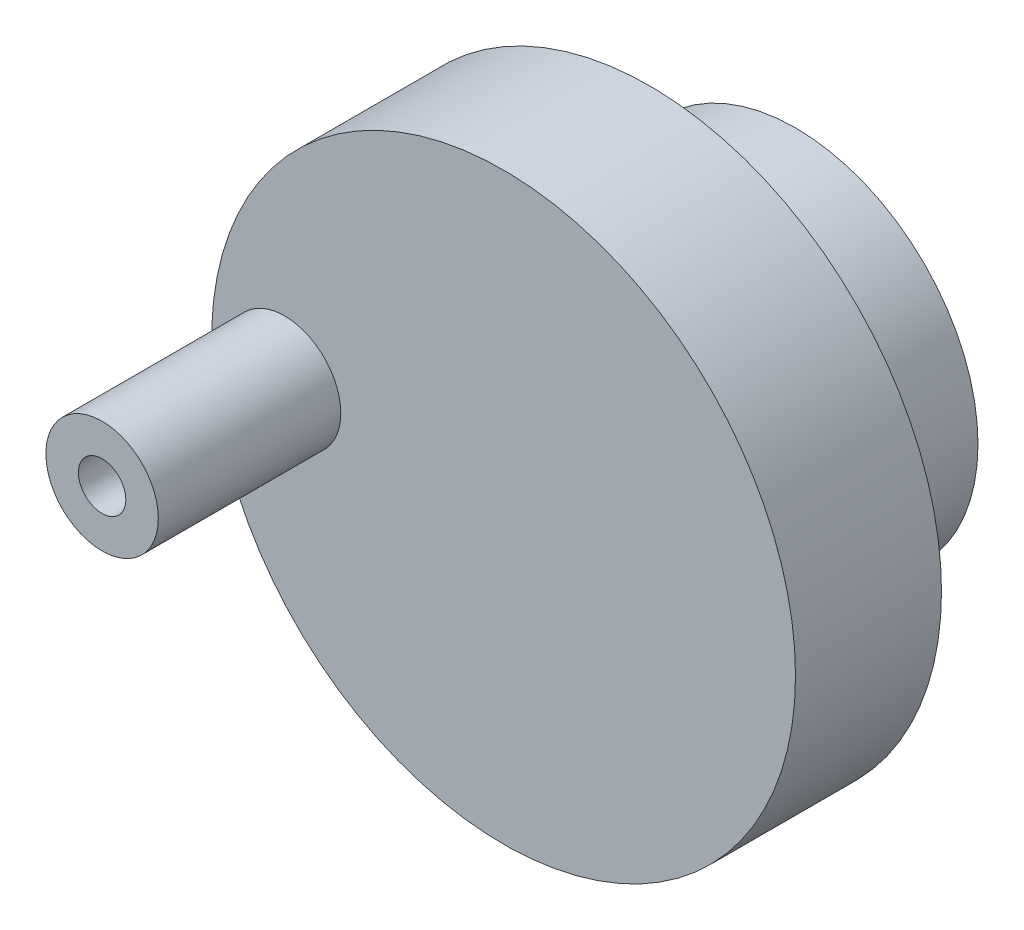
ISO-10303-21;
HEADER;
FILE_DESCRIPTION(('STEP AP214'),'2;1');
FILE_NAME('part.step','',(''),(''),'','','');
FILE_SCHEMA(('AUTOMOTIVE_DESIGN { 1 0 10303 214 1 1 1 1 }'));
ENDSEC;
DATA;
#1=APPLICATION_CONTEXT('core data for automotive mechanical design processes');
#2=APPLICATION_PROTOCOL_DEFINITION('international standard','automotive_design',2000,#1);
#3=PRODUCT_CONTEXT('',#1,'mechanical');
#4=PRODUCT('Part','Part','',(#3));
#5=PRODUCT_RELATED_PRODUCT_CATEGORY('part','',(#4));
#6=PRODUCT_DEFINITION_FORMATION('','',#4);
#7=PRODUCT_DEFINITION_CONTEXT('part definition',#1,'design');
#8=PRODUCT_DEFINITION('design','',#6,#7);
#9=PRODUCT_DEFINITION_SHAPE('','',#8);
#10=(LENGTH_UNIT() NAMED_UNIT(*) SI_UNIT(.MILLI.,.METRE.));
#11=(NAMED_UNIT(*) PLANE_ANGLE_UNIT() SI_UNIT($,.RADIAN.));
#12=(NAMED_UNIT(*) SI_UNIT($,.STERADIAN.) SOLID_ANGLE_UNIT());
#13=UNCERTAINTY_MEASURE_WITH_UNIT(LENGTH_MEASURE(1.E-05),#10,'distance_accuracy_value','');
#14=(GEOMETRIC_REPRESENTATION_CONTEXT(3) GLOBAL_UNCERTAINTY_ASSIGNED_CONTEXT((#13)) GLOBAL_UNIT_ASSIGNED_CONTEXT((#10,
#11,#12)) REPRESENTATION_CONTEXT('',''));
#15=CARTESIAN_POINT('',(0.,0.,0.));
#16=DIRECTION('',(0.,0.,1.));
#17=DIRECTION('',(1.,0.,0.));
#18=AXIS2_PLACEMENT_3D('',#15,#16,#17);
#19=CARTESIAN_POINT('',(0.,0.,0.));
#20=DIRECTION('',(0.,0.,1.));
#21=DIRECTION('',(1.,0.,0.));
#22=AXIS2_PLACEMENT_3D('',#19,#20,#21);
#23=PLANE('',#22);
#24=CARTESIAN_POINT('',(0.,0.,0.));
#25=DIRECTION('',(0.,0.,1.));
#26=DIRECTION('',(1.,0.,0.));
#27=AXIS2_PLACEMENT_3D('',#24,#25,#26);
#28=CIRCLE('',#27,17.5);
#29=CARTESIAN_POINT('',(17.5,0.,0.));
#30=VERTEX_POINT('',#29);
#31=EDGE_CURVE('E11',#30,#30,#28,.T.);
#32=ORIENTED_EDGE('',*,*,#31,.T.);
#33=EDGE_LOOP('',(#32));
#34=FACE_BOUND('',#33,.T.);
#35=CARTESIAN_POINT('',(0.,0.,0.));
#36=DIRECTION('',(0.,0.,1.));
#37=DIRECTION('',(1.,0.,0.));
#38=AXIS2_PLACEMENT_3D('',#35,#36,#37);
#39=CIRCLE('',#38,20.);
#40=CARTESIAN_POINT('',(20.,0.,0.));
#41=VERTEX_POINT('',#40);
#42=EDGE_CURVE('E155',#41,#41,#39,.T.);
#43=ORIENTED_EDGE('',*,*,#42,.F.);
#44=EDGE_LOOP('',(#43));
#45=FACE_BOUND('',#44,.T.);
#46=ADVANCED_FACE('F42',(#34,#45),#23,.F.);
#47=CARTESIAN_POINT('',(0.,0.,10.));
#48=DIRECTION('',(0.,0.,-1.));
#49=DIRECTION('',(-1.,0.,0.));
#50=AXIS2_PLACEMENT_3D('',#47,#48,#49);
#51=CYLINDRICAL_SURFACE('',#50,20.);
#52=CARTESIAN_POINT('',(0.,0.,10.));
#53=DIRECTION('',(0.,0.,1.));
#54=DIRECTION('',(1.,0.,0.));
#55=AXIS2_PLACEMENT_3D('',#52,#53,#54);
#56=CIRCLE('',#55,20.);
#57=CARTESIAN_POINT('',(20.,0.,10.));
#58=VERTEX_POINT('',#57);
#59=EDGE_CURVE('E158',#58,#58,#56,.T.);
#60=ORIENTED_EDGE('',*,*,#59,.F.);
#61=EDGE_LOOP('',(#60));
#62=FACE_BOUND('',#61,.T.);
#63=ORIENTED_EDGE('',*,*,#42,.T.);
#64=EDGE_LOOP('',(#63));
#65=FACE_BOUND('',#64,.T.);
#66=ADVANCED_FACE('F184',(#62,#65),#51,.T.);
#67=CARTESIAN_POINT('',(0.,0.,10.));
#68=DIRECTION('',(0.,0.,1.));
#69=DIRECTION('',(1.,0.,0.));
#70=AXIS2_PLACEMENT_3D('',#67,#68,#69);
#71=PLANE('',#70);
#72=CARTESIAN_POINT('',(-15.,0.,10.));
#73=DIRECTION('',(0.,0.,1.));
#74=DIRECTION('',(1.,0.,0.));
#75=AXIS2_PLACEMENT_3D('',#72,#73,#74);
#76=CIRCLE('',#75,3.85);
#77=CARTESIAN_POINT('',(-11.15,0.,10.));
#78=VERTEX_POINT('',#77);
#79=EDGE_CURVE('E151',#78,#78,#76,.T.);
#80=ORIENTED_EDGE('',*,*,#79,.F.);
#81=EDGE_LOOP('',(#80));
#82=FACE_BOUND('',#81,.T.);
#83=ORIENTED_EDGE('',*,*,#59,.T.);
#84=EDGE_LOOP('',(#83));
#85=FACE_BOUND('',#84,.T.);
#86=ADVANCED_FACE('F191',(#82,#85),#71,.T.);
#87=CARTESIAN_POINT('',(-15.,0.,22.5));
#88=DIRECTION('',(0.,0.,-1.));
#89=DIRECTION('',(-1.,0.,0.));
#90=AXIS2_PLACEMENT_3D('',#87,#88,#89);
#91=CYLINDRICAL_SURFACE('',#90,3.85);
#92=CARTESIAN_POINT('',(-15.,0.,22.5));
#93=DIRECTION('',(0.,0.,1.));
#94=DIRECTION('',(1.,0.,0.));
#95=AXIS2_PLACEMENT_3D('',#92,#93,#94);
#96=CIRCLE('',#95,3.85);
#97=CARTESIAN_POINT('',(-11.15,0.,22.5));
#98=VERTEX_POINT('',#97);
#99=EDGE_CURVE('E152',#98,#98,#96,.T.);
#100=ORIENTED_EDGE('',*,*,#99,.F.);
#101=EDGE_LOOP('',(#100));
#102=FACE_BOUND('',#101,.T.);
#103=ORIENTED_EDGE('',*,*,#79,.T.);
#104=EDGE_LOOP('',(#103));
#105=FACE_BOUND('',#104,.T.);
#106=ADVANCED_FACE('F239',(#102,#105),#91,.T.);
#107=CARTESIAN_POINT('',(-15.,0.,22.5));
#108=DIRECTION('',(0.,0.,1.));
#109=DIRECTION('',(1.,0.,0.));
#110=AXIS2_PLACEMENT_3D('',#107,#108,#109);
#111=PLANE('',#110);
#112=CARTESIAN_POINT('',(-15.,0.,22.5));
#113=DIRECTION('',(0.,0.,1.));
#114=DIRECTION('',(1.,0.,0.));
#115=AXIS2_PLACEMENT_3D('',#112,#113,#114);
#116=CIRCLE('',#115,1.625);
#117=CARTESIAN_POINT('',(-13.375,0.,22.5));
#118=VERTEX_POINT('',#117);
#119=EDGE_CURVE('E342',#118,#118,#116,.T.);
#120=ORIENTED_EDGE('',*,*,#119,.F.);
#121=EDGE_LOOP('',(#120));
#122=FACE_BOUND('',#121,.T.);
#123=ORIENTED_EDGE('',*,*,#99,.T.);
#124=EDGE_LOOP('',(#123));
#125=FACE_BOUND('',#124,.T.);
#126=ADVANCED_FACE('F234',(#122,#125),#111,.T.);
#127=CARTESIAN_POINT('',(0.,0.,-10.));
#128=DIRECTION('',(0.,0.,-1.));
#129=DIRECTION('',(-1.,0.,0.));
#130=AXIS2_PLACEMENT_3D('',#127,#128,#129);
#131=PLANE('',#130);
#132=CARTESIAN_POINT('',(0.,0.,-10.));
#133=DIRECTION('',(0.,0.,-1.));
#134=DIRECTION('',(-1.,0.,0.));
#135=AXIS2_PLACEMENT_3D('',#132,#133,#134);
#136=CIRCLE('',#135,12.5);
#137=CARTESIAN_POINT('',(-12.5,0.,-10.));
#138=VERTEX_POINT('',#137);
#139=EDGE_CURVE('E110',#138,#138,#136,.T.);
#140=ORIENTED_EDGE('',*,*,#139,.T.);
#141=EDGE_LOOP('',(#140));
#142=FACE_BOUND('',#141,.T.);
#143=DIRECTION('',(1.,0.,0.));
#144=VECTOR('',#143,1.);
#145=CARTESIAN_POINT('',(-3.46410161513776,6.,-10.));
#146=LINE('',#145,#144);
#147=CARTESIAN_POINT('',(-3.46410161513776,6.,-10.));
#148=VERTEX_POINT('',#147);
#149=CARTESIAN_POINT('',(3.46410161513775,6.,-10.));
#150=VERTEX_POINT('',#149);
#151=EDGE_CURVE('E102',#148,#150,#146,.T.);
#152=ORIENTED_EDGE('',*,*,#151,.F.);
#153=DIRECTION('',(0.5,0.866025403784438,0.));
#154=VECTOR('',#153,1.);
#155=CARTESIAN_POINT('',(-6.92820323027551,0.,-10.));
#156=LINE('',#155,#154);
#157=CARTESIAN_POINT('',(-6.92820323027551,0.,-10.));
#158=VERTEX_POINT('',#157);
#159=EDGE_CURVE('E94',#158,#148,#156,.T.);
#160=ORIENTED_EDGE('',*,*,#159,.F.);
#161=DIRECTION('',(-0.5,0.866025403784439,0.));
#162=VECTOR('',#161,1.);
#163=CARTESIAN_POINT('',(-3.46410161513776,-6.00000000000001,-10.));
#164=LINE('',#163,#162);
#165=CARTESIAN_POINT('',(-3.46410161513776,-6.00000000000001,-10.));
#166=VERTEX_POINT('',#165);
#167=EDGE_CURVE('E125',#166,#158,#164,.T.);
#168=ORIENTED_EDGE('',*,*,#167,.F.);
#169=DIRECTION('',(-1.,0.,0.));
#170=VECTOR('',#169,1.);
#171=CARTESIAN_POINT('',(3.46410161513775,-6.,-10.));
#172=LINE('',#171,#170);
#173=CARTESIAN_POINT('',(3.46410161513775,-6.,-10.));
#174=VERTEX_POINT('',#173);
#175=EDGE_CURVE('E123',#174,#166,#172,.T.);
#176=ORIENTED_EDGE('',*,*,#175,.F.);
#177=DIRECTION('',(-0.5,-0.866025403784439,0.));
#178=VECTOR('',#177,1.);
#179=CARTESIAN_POINT('',(6.92820323027551,0.,-10.));
#180=LINE('',#179,#178);
#181=CARTESIAN_POINT('',(6.92820323027551,0.,-10.));
#182=VERTEX_POINT('',#181);
#183=EDGE_CURVE('E118',#182,#174,#180,.T.);
#184=ORIENTED_EDGE('',*,*,#183,.F.);
#185=DIRECTION('',(0.5,-0.866025403784439,0.));
#186=VECTOR('',#185,1.);
#187=CARTESIAN_POINT('',(3.46410161513775,6.,-10.));
#188=LINE('',#187,#186);
#189=EDGE_CURVE('E116',#150,#182,#188,.T.);
#190=ORIENTED_EDGE('',*,*,#189,.F.);
#191=EDGE_LOOP('',(#152,#160,#168,#176,#184,#190));
#192=FACE_BOUND('',#191,.T.);
#193=ADVANCED_FACE('F114',(#142,#192),#131,.T.);
#194=CARTESIAN_POINT('',(0.,0.,-10.));
#195=DIRECTION('',(0.,0.,1.));
#196=DIRECTION('',(1.,0.,0.));
#197=AXIS2_PLACEMENT_3D('',#194,#195,#196);
#198=CYLINDRICAL_SURFACE('',#197,12.5);
#199=CARTESIAN_POINT('',(0.,0.,-5.));
#200=DIRECTION('',(0.,0.,1.));
#201=DIRECTION('',(1.,0.,0.));
#202=AXIS2_PLACEMENT_3D('',#199,#200,#201);
#203=CIRCLE('',#202,12.5);
#204=CARTESIAN_POINT('',(12.5,0.,-5.));
#205=VERTEX_POINT('',#204);
#206=EDGE_CURVE('E50',#205,#205,#203,.F.);
#207=ORIENTED_EDGE('',*,*,#206,.T.);
#208=EDGE_LOOP('',(#207));
#209=FACE_BOUND('',#208,.T.);
#210=ORIENTED_EDGE('',*,*,#139,.F.);
#211=EDGE_LOOP('',(#210));
#212=FACE_BOUND('',#211,.T.);
#213=ADVANCED_FACE('F169',(#209,#212),#198,.T.);
#214=CARTESIAN_POINT('',(-6.92820323027551,0.,-10.));
#215=DIRECTION('',(0.866025403784439,-0.5,0.));
#216=DIRECTION('',(0.5,0.866025403784439,0.));
#217=AXIS2_PLACEMENT_3D('',#214,#215,#216);
#218=PLANE('',#217);
#219=DIRECTION('',(0.5,0.866025403784438,0.));
#220=VECTOR('',#219,1.);
#221=CARTESIAN_POINT('',(-6.92820323027551,0.,0.));
#222=LINE('',#221,#220);
#223=CARTESIAN_POINT('',(-6.92820323027551,0.,0.));
#224=VERTEX_POINT('',#223);
#225=CARTESIAN_POINT('',(-3.46410161513776,6.,0.));
#226=VERTEX_POINT('',#225);
#227=EDGE_CURVE('E127',#224,#226,#222,.T.);
#228=ORIENTED_EDGE('',*,*,#227,.F.);
#229=DIRECTION('',(0.,0.,1.));
#230=VECTOR('',#229,1.);
#231=CARTESIAN_POINT('',(-6.92820323027551,0.,-10.));
#232=LINE('',#231,#230);
#233=EDGE_CURVE('E57',#158,#224,#232,.T.);
#234=ORIENTED_EDGE('',*,*,#233,.F.);
#235=ORIENTED_EDGE('',*,*,#159,.T.);
#236=DIRECTION('',(0.,0.,1.));
#237=VECTOR('',#236,1.);
#238=CARTESIAN_POINT('',(-3.46410161513776,6.,-10.));
#239=LINE('',#238,#237);
#240=EDGE_CURVE('E97',#148,#226,#239,.T.);
#241=ORIENTED_EDGE('',*,*,#240,.T.);
#242=EDGE_LOOP('',(#228,#234,#235,#241));
#243=FACE_BOUND('',#242,.T.);
#244=ADVANCED_FACE('F96',(#243),#218,.T.);
#245=CARTESIAN_POINT('',(-3.46410161513776,6.,-10.));
#246=DIRECTION('',(0.,-1.,0.));
#247=DIRECTION('',(1.,0.,0.));
#248=AXIS2_PLACEMENT_3D('',#245,#246,#247);
#249=PLANE('',#248);
#250=DIRECTION('',(1.,0.,0.));
#251=VECTOR('',#250,1.);
#252=CARTESIAN_POINT('',(-3.46410161513776,6.,0.));
#253=LINE('',#252,#251);
#254=CARTESIAN_POINT('',(3.46410161513775,6.,0.));
#255=VERTEX_POINT('',#254);
#256=EDGE_CURVE('E109',#226,#255,#253,.T.);
#257=ORIENTED_EDGE('',*,*,#256,.F.);
#258=ORIENTED_EDGE('',*,*,#240,.F.);
#259=ORIENTED_EDGE('',*,*,#151,.T.);
#260=DIRECTION('',(0.,0.,1.));
#261=VECTOR('',#260,1.);
#262=CARTESIAN_POINT('',(3.46410161513775,6.,-10.));
#263=LINE('',#262,#261);
#264=EDGE_CURVE('E111',#150,#255,#263,.T.);
#265=ORIENTED_EDGE('',*,*,#264,.T.);
#266=EDGE_LOOP('',(#257,#258,#259,#265));
#267=FACE_BOUND('',#266,.T.);
#268=ADVANCED_FACE('F106',(#267),#249,.T.);
#269=CARTESIAN_POINT('',(3.46410161513775,6.,-10.));
#270=DIRECTION('',(-0.866025403784439,-0.5,0.));
#271=DIRECTION('',(0.5,-0.866025403784439,0.));
#272=AXIS2_PLACEMENT_3D('',#269,#270,#271);
#273=PLANE('',#272);
#274=DIRECTION('',(0.5,-0.866025403784439,0.));
#275=VECTOR('',#274,1.);
#276=CARTESIAN_POINT('',(3.46410161513775,6.,0.));
#277=LINE('',#276,#275);
#278=CARTESIAN_POINT('',(6.92820323027551,0.,0.));
#279=VERTEX_POINT('',#278);
#280=EDGE_CURVE('E131',#255,#279,#277,.T.);
#281=ORIENTED_EDGE('',*,*,#280,.F.);
#282=ORIENTED_EDGE('',*,*,#264,.F.);
#283=ORIENTED_EDGE('',*,*,#189,.T.);
#284=DIRECTION('',(0.,0.,1.));
#285=VECTOR('',#284,1.);
#286=CARTESIAN_POINT('',(6.92820323027551,0.,-10.));
#287=LINE('',#286,#285);
#288=EDGE_CURVE('E146',#182,#279,#287,.T.);
#289=ORIENTED_EDGE('',*,*,#288,.T.);
#290=EDGE_LOOP('',(#281,#282,#283,#289));
#291=FACE_BOUND('',#290,.T.);
#292=ADVANCED_FACE('F219',(#291),#273,.T.);
#293=CARTESIAN_POINT('',(6.92820323027551,0.,-10.));
#294=DIRECTION('',(-0.866025403784439,0.5,0.));
#295=DIRECTION('',(-0.5,-0.866025403784439,0.));
#296=AXIS2_PLACEMENT_3D('',#293,#294,#295);
#297=PLANE('',#296);
#298=DIRECTION('',(-0.5,-0.866025403784439,0.));
#299=VECTOR('',#298,1.);
#300=CARTESIAN_POINT('',(6.92820323027551,0.,0.));
#301=LINE('',#300,#299);
#302=CARTESIAN_POINT('',(3.46410161513775,-6.,0.));
#303=VERTEX_POINT('',#302);
#304=EDGE_CURVE('E134',#279,#303,#301,.T.);
#305=ORIENTED_EDGE('',*,*,#304,.F.);
#306=ORIENTED_EDGE('',*,*,#288,.F.);
#307=ORIENTED_EDGE('',*,*,#183,.T.);
#308=DIRECTION('',(0.,0.,1.));
#309=VECTOR('',#308,1.);
#310=CARTESIAN_POINT('',(3.46410161513775,-6.,-10.));
#311=LINE('',#310,#309);
#312=EDGE_CURVE('E144',#174,#303,#311,.T.);
#313=ORIENTED_EDGE('',*,*,#312,.T.);
#314=EDGE_LOOP('',(#305,#306,#307,#313));
#315=FACE_BOUND('',#314,.T.);
#316=ADVANCED_FACE('F216',(#315),#297,.T.);
#317=CARTESIAN_POINT('',(3.46410161513775,-6.,-10.));
#318=DIRECTION('',(0.,1.,0.));
#319=DIRECTION('',(-1.,0.,0.));
#320=AXIS2_PLACEMENT_3D('',#317,#318,#319);
#321=PLANE('',#320);
#322=DIRECTION('',(-1.,0.,0.));
#323=VECTOR('',#322,1.);
#324=CARTESIAN_POINT('',(3.46410161513775,-6.,0.));
#325=LINE('',#324,#323);
#326=CARTESIAN_POINT('',(-3.46410161513776,-6.00000000000001,0.));
#327=VERTEX_POINT('',#326);
#328=EDGE_CURVE('E137',#303,#327,#325,.T.);
#329=ORIENTED_EDGE('',*,*,#328,.F.);
#330=ORIENTED_EDGE('',*,*,#312,.F.);
#331=ORIENTED_EDGE('',*,*,#175,.T.);
#332=DIRECTION('',(0.,0.,1.));
#333=VECTOR('',#332,1.);
#334=CARTESIAN_POINT('',(-3.46410161513776,-6.00000000000001,-10.));
#335=LINE('',#334,#333);
#336=EDGE_CURVE('E62',#166,#327,#335,.T.);
#337=ORIENTED_EDGE('',*,*,#336,.T.);
#338=EDGE_LOOP('',(#329,#330,#331,#337));
#339=FACE_BOUND('',#338,.T.);
#340=ADVANCED_FACE('F207',(#339),#321,.T.);
#341=CARTESIAN_POINT('',(-3.46410161513776,-6.00000000000001,-10.));
#342=DIRECTION('',(0.866025403784439,0.5,0.));
#343=DIRECTION('',(-0.5,0.866025403784439,0.));
#344=AXIS2_PLACEMENT_3D('',#341,#342,#343);
#345=PLANE('',#344);
#346=DIRECTION('',(-0.5,0.866025403784439,0.));
#347=VECTOR('',#346,1.);
#348=CARTESIAN_POINT('',(-3.46410161513776,-6.00000000000001,0.));
#349=LINE('',#348,#347);
#350=EDGE_CURVE('E103',#327,#224,#349,.T.);
#351=ORIENTED_EDGE('',*,*,#350,.F.);
#352=ORIENTED_EDGE('',*,*,#336,.F.);
#353=ORIENTED_EDGE('',*,*,#167,.T.);
#354=ORIENTED_EDGE('',*,*,#233,.T.);
#355=EDGE_LOOP('',(#351,#352,#353,#354));
#356=FACE_BOUND('',#355,.T.);
#357=ADVANCED_FACE('F197',(#356),#345,.T.);
#358=ORIENTED_EDGE('',*,*,#350,.T.);
#359=ORIENTED_EDGE('',*,*,#227,.T.);
#360=ORIENTED_EDGE('',*,*,#256,.T.);
#361=ORIENTED_EDGE('',*,*,#280,.T.);
#362=ORIENTED_EDGE('',*,*,#304,.T.);
#363=ORIENTED_EDGE('',*,*,#328,.T.);
#364=EDGE_LOOP('',(#358,#359,#360,#361,#362,#363));
#365=FACE_BOUND('',#364,.T.);
#366=ADVANCED_FACE('F187',(#365),#23,.F.);
#367=CARTESIAN_POINT('',(-15.,0.,17.3));
#368=DIRECTION('',(0.,0.,1.));
#369=DIRECTION('',(1.,0.,0.));
#370=AXIS2_PLACEMENT_3D('',#367,#368,#369);
#371=PLANE('',#370);
#372=CARTESIAN_POINT('',(-15.,0.,17.3));
#373=DIRECTION('',(0.,0.,1.));
#374=DIRECTION('',(1.,0.,0.));
#375=AXIS2_PLACEMENT_3D('',#372,#373,#374);
#376=CIRCLE('',#375,1.625);
#377=CARTESIAN_POINT('',(-13.375,0.,17.3));
#378=VERTEX_POINT('',#377);
#379=EDGE_CURVE('E165',#378,#378,#376,.T.);
#380=ORIENTED_EDGE('',*,*,#379,.T.);
#381=EDGE_LOOP('',(#380));
#382=FACE_BOUND('',#381,.T.);
#383=CARTESIAN_POINT('',(-15.,0.,17.3));
#384=DIRECTION('',(0.,0.,1.));
#385=DIRECTION('',(1.,0.,0.));
#386=AXIS2_PLACEMENT_3D('',#383,#384,#385);
#387=CIRCLE('',#386,1.5);
#388=CARTESIAN_POINT('',(-13.5,0.,17.3));
#389=VERTEX_POINT('',#388);
#390=EDGE_CURVE('E163',#389,#389,#387,.F.);
#391=ORIENTED_EDGE('',*,*,#390,.T.);
#392=EDGE_LOOP('',(#391));
#393=FACE_BOUND('',#392,.T.);
#394=ADVANCED_FACE('F196',(#382,#393),#371,.T.);
#395=CARTESIAN_POINT('',(-15.,0.,17.3));
#396=DIRECTION('',(0.,0.,1.));
#397=DIRECTION('',(1.,0.,0.));
#398=AXIS2_PLACEMENT_3D('',#395,#396,#397);
#399=CYLINDRICAL_SURFACE('',#398,1.625);
#400=ORIENTED_EDGE('',*,*,#379,.F.);
#401=EDGE_LOOP('',(#400));
#402=FACE_BOUND('',#401,.T.);
#403=ORIENTED_EDGE('',*,*,#119,.T.);
#404=EDGE_LOOP('',(#403));
#405=FACE_BOUND('',#404,.T.);
#406=ADVANCED_FACE('F204',(#402,#405),#399,.F.);
#407=CARTESIAN_POINT('',(-15.,0.,6.));
#408=DIRECTION('',(0.,0.,1.));
#409=DIRECTION('',(1.,0.,0.));
#410=AXIS2_PLACEMENT_3D('',#407,#408,#409);
#411=PLANE('',#410);
#412=CARTESIAN_POINT('',(-15.,0.,6.));
#413=DIRECTION('',(0.,0.,1.));
#414=DIRECTION('',(1.,0.,0.));
#415=AXIS2_PLACEMENT_3D('',#412,#413,#414);
#416=CIRCLE('',#415,1.5);
#417=CARTESIAN_POINT('',(-13.5,0.,6.));
#418=VERTEX_POINT('',#417);
#419=EDGE_CURVE('E129',#418,#418,#416,.T.);
#420=ORIENTED_EDGE('',*,*,#419,.T.);
#421=EDGE_LOOP('',(#420));
#422=FACE_BOUND('',#421,.T.);
#423=ADVANCED_FACE('F179',(#422),#411,.T.);
#424=CARTESIAN_POINT('',(-15.,0.,6.));
#425=DIRECTION('',(0.,0.,1.));
#426=DIRECTION('',(1.,0.,0.));
#427=AXIS2_PLACEMENT_3D('',#424,#425,#426);
#428=CYLINDRICAL_SURFACE('',#427,1.5);
#429=ORIENTED_EDGE('',*,*,#419,.F.);
#430=EDGE_LOOP('',(#429));
#431=FACE_BOUND('',#430,.T.);
#432=ORIENTED_EDGE('',*,*,#390,.F.);
#433=EDGE_LOOP('',(#432));
#434=FACE_BOUND('',#433,.T.);
#435=ADVANCED_FACE('F173',(#431,#434),#428,.F.);
#436=CARTESIAN_POINT('',(0.,0.,-5.));
#437=DIRECTION('',(0.,0.,1.));
#438=DIRECTION('',(1.,0.,0.));
#439=AXIS2_PLACEMENT_3D('',#436,#437,#438);
#440=TOROIDAL_SURFACE('',#439,17.5,5.);
#441=ORIENTED_EDGE('',*,*,#31,.F.);
#442=EDGE_LOOP('',(#441));
#443=FACE_BOUND('',#442,.T.);
#444=ORIENTED_EDGE('',*,*,#206,.F.);
#445=EDGE_LOOP('',(#444));
#446=FACE_BOUND('',#445,.T.);
#447=ADVANCED_FACE('F44',(#443,#446),#440,.F.);
#448=CLOSED_SHELL('',(#46,#66,#86,#106,#126,#193,#213,#244,#268,#292,#316,#340,#357,#366,#394,
#406,#423,#435,#447));
#449=MANIFOLD_SOLID_BREP('B2',#448);
#450=ADVANCED_BREP_SHAPE_REPRESENTATION('',(#18,#449),#14);
#451=SHAPE_DEFINITION_REPRESENTATION(#9,#450);
ENDSEC;
END-ISO-10303-21;
